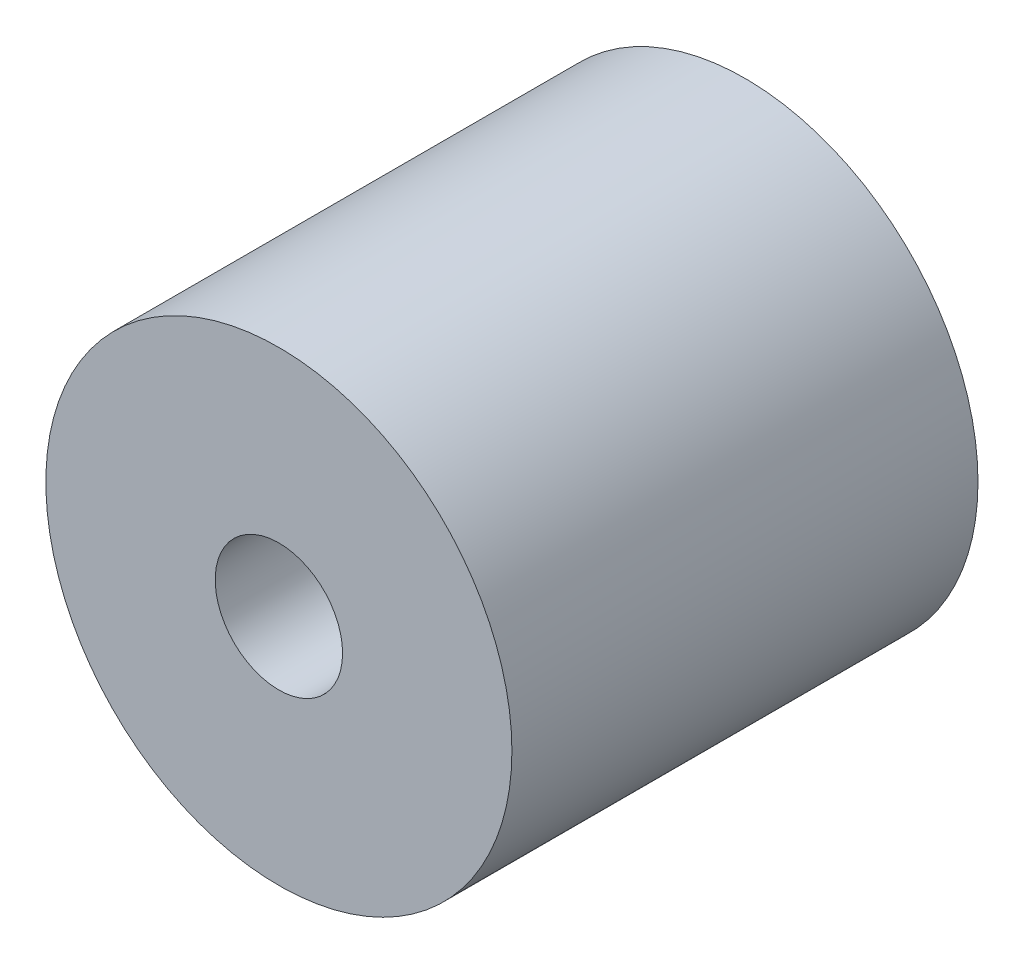
ISO-10303-21;
HEADER;
FILE_DESCRIPTION(('STEP AP214'),'2;1');
FILE_NAME('part.step','',(''),(''),'','','');
FILE_SCHEMA(('AUTOMOTIVE_DESIGN { 1 0 10303 214 1 1 1 1 }'));
ENDSEC;
DATA;
#1=APPLICATION_CONTEXT('core data for automotive mechanical design processes');
#2=APPLICATION_PROTOCOL_DEFINITION('international standard','automotive_design',2000,#1);
#3=PRODUCT_CONTEXT('',#1,'mechanical');
#4=PRODUCT('Part','Part','',(#3));
#5=PRODUCT_RELATED_PRODUCT_CATEGORY('part','',(#4));
#6=PRODUCT_DEFINITION_FORMATION('','',#4);
#7=PRODUCT_DEFINITION_CONTEXT('part definition',#1,'design');
#8=PRODUCT_DEFINITION('design','',#6,#7);
#9=PRODUCT_DEFINITION_SHAPE('','',#8);
#10=(LENGTH_UNIT() NAMED_UNIT(*) SI_UNIT(.MILLI.,.METRE.));
#11=(NAMED_UNIT(*) PLANE_ANGLE_UNIT() SI_UNIT($,.RADIAN.));
#12=(NAMED_UNIT(*) SI_UNIT($,.STERADIAN.) SOLID_ANGLE_UNIT());
#13=UNCERTAINTY_MEASURE_WITH_UNIT(LENGTH_MEASURE(1.E-05),#10,'distance_accuracy_value','');
#14=(GEOMETRIC_REPRESENTATION_CONTEXT(3) GLOBAL_UNCERTAINTY_ASSIGNED_CONTEXT((#13)) GLOBAL_UNIT_ASSIGNED_CONTEXT((#10,
#11,#12)) REPRESENTATION_CONTEXT('',''));
#15=CARTESIAN_POINT('',(0.,0.,0.));
#16=DIRECTION('',(0.,0.,1.));
#17=DIRECTION('',(1.,0.,0.));
#18=AXIS2_PLACEMENT_3D('',#15,#16,#17);
#19=CARTESIAN_POINT('',(0.,0.,30.));
#20=DIRECTION('',(0.,0.,1.));
#21=DIRECTION('',(1.,0.,0.));
#22=AXIS2_PLACEMENT_3D('',#19,#20,#21);
#23=PLANE('',#22);
#24=CARTESIAN_POINT('',(0.,0.,30.));
#25=DIRECTION('',(0.,0.,1.));
#26=DIRECTION('',(1.,0.,0.));
#27=AXIS2_PLACEMENT_3D('',#24,#25,#26);
#28=CIRCLE('',#27,15.);
#29=CARTESIAN_POINT('',(15.,0.,30.));
#30=VERTEX_POINT('',#29);
#31=EDGE_CURVE('E10',#30,#30,#28,.T.);
#32=ORIENTED_EDGE('',*,*,#31,.T.);
#33=EDGE_LOOP('',(#32));
#34=FACE_BOUND('',#33,.T.);
#35=CARTESIAN_POINT('',(0.,0.,30.));
#36=DIRECTION('',(0.,0.,1.));
#37=DIRECTION('',(1.,0.,0.));
#38=AXIS2_PLACEMENT_3D('',#35,#36,#37);
#39=CIRCLE('',#38,4.1);
#40=CARTESIAN_POINT('',(4.1,0.,30.));
#41=VERTEX_POINT('',#40);
#42=EDGE_CURVE('E56',#41,#41,#39,.T.);
#43=ORIENTED_EDGE('',*,*,#42,.F.);
#44=EDGE_LOOP('',(#43));
#45=FACE_BOUND('',#44,.T.);
#46=ADVANCED_FACE('F43',(#34,#45),#23,.T.);
#47=CARTESIAN_POINT('',(0.,0.,0.));
#48=DIRECTION('',(0.,0.,1.));
#49=DIRECTION('',(1.,0.,0.));
#50=AXIS2_PLACEMENT_3D('',#47,#48,#49);
#51=PLANE('',#50);
#52=CARTESIAN_POINT('',(0.,0.,0.));
#53=DIRECTION('',(0.,0.,1.));
#54=DIRECTION('',(1.,0.,0.));
#55=AXIS2_PLACEMENT_3D('',#52,#53,#54);
#56=CIRCLE('',#55,15.);
#57=CARTESIAN_POINT('',(15.,0.,0.));
#58=VERTEX_POINT('',#57);
#59=EDGE_CURVE('E47',#58,#58,#56,.T.);
#60=ORIENTED_EDGE('',*,*,#59,.F.);
#61=EDGE_LOOP('',(#60));
#62=FACE_BOUND('',#61,.T.);
#63=CARTESIAN_POINT('',(0.,0.,0.));
#64=DIRECTION('',(0.,0.,1.));
#65=DIRECTION('',(1.,0.,0.));
#66=AXIS2_PLACEMENT_3D('',#63,#64,#65);
#67=CIRCLE('',#66,4.1);
#68=CARTESIAN_POINT('',(4.1,0.,0.));
#69=VERTEX_POINT('',#68);
#70=EDGE_CURVE('E58',#69,#69,#67,.T.);
#71=ORIENTED_EDGE('',*,*,#70,.T.);
#72=EDGE_LOOP('',(#71));
#73=FACE_BOUND('',#72,.T.);
#74=ADVANCED_FACE('F70',(#62,#73),#51,.F.);
#75=CARTESIAN_POINT('',(0.,0.,30.));
#76=DIRECTION('',(0.,0.,-1.));
#77=DIRECTION('',(-1.,0.,0.));
#78=AXIS2_PLACEMENT_3D('',#75,#76,#77);
#79=CYLINDRICAL_SURFACE('',#78,15.);
#80=ORIENTED_EDGE('',*,*,#31,.F.);
#81=EDGE_LOOP('',(#80));
#82=FACE_BOUND('',#81,.T.);
#83=ORIENTED_EDGE('',*,*,#59,.T.);
#84=EDGE_LOOP('',(#83));
#85=FACE_BOUND('',#84,.T.);
#86=ADVANCED_FACE('F45',(#82,#85),#79,.T.);
#87=CARTESIAN_POINT('',(0.,0.,30.));
#88=DIRECTION('',(0.,0.,-1.));
#89=DIRECTION('',(-1.,0.,0.));
#90=AXIS2_PLACEMENT_3D('',#87,#88,#89);
#91=CYLINDRICAL_SURFACE('',#90,4.1);
#92=ORIENTED_EDGE('',*,*,#42,.T.);
#93=EDGE_LOOP('',(#92));
#94=FACE_BOUND('',#93,.T.);
#95=ORIENTED_EDGE('',*,*,#70,.F.);
#96=EDGE_LOOP('',(#95));
#97=FACE_BOUND('',#96,.T.);
#98=ADVANCED_FACE('F66',(#94,#97),#91,.F.);
#99=CLOSED_SHELL('',(#46,#74,#86,#98));
#100=MANIFOLD_SOLID_BREP('B2',#99);
#101=ADVANCED_BREP_SHAPE_REPRESENTATION('',(#18,#100),#14);
#102=SHAPE_DEFINITION_REPRESENTATION(#9,#101);
ENDSEC;
END-ISO-10303-21;
